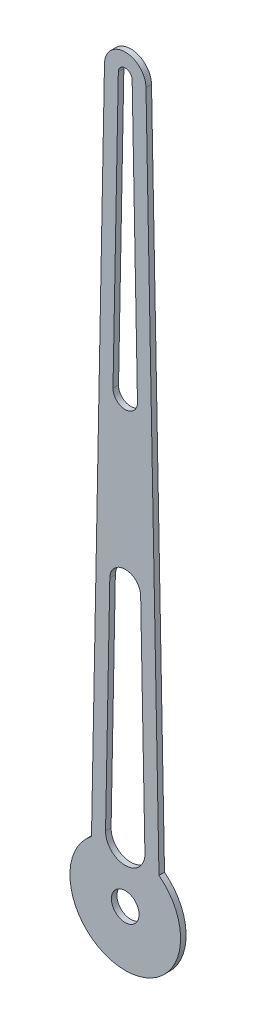
ISO-10303-21;
HEADER;
FILE_DESCRIPTION(('STEP AP214'),'2;1');
FILE_NAME('part.step','',(''),(''),'','','');
FILE_SCHEMA(('AUTOMOTIVE_DESIGN { 1 0 10303 214 1 1 1 1 }'));
ENDSEC;
DATA;
#1=APPLICATION_CONTEXT('core data for automotive mechanical design processes');
#2=APPLICATION_PROTOCOL_DEFINITION('international standard','automotive_design',2000,#1);
#3=PRODUCT_CONTEXT('',#1,'mechanical');
#4=PRODUCT('Part','Part','',(#3));
#5=PRODUCT_RELATED_PRODUCT_CATEGORY('part','',(#4));
#6=PRODUCT_DEFINITION_FORMATION('','',#4);
#7=PRODUCT_DEFINITION_CONTEXT('part definition',#1,'design');
#8=PRODUCT_DEFINITION('design','',#6,#7);
#9=PRODUCT_DEFINITION_SHAPE('','',#8);
#10=(LENGTH_UNIT() NAMED_UNIT(*) SI_UNIT(.MILLI.,.METRE.));
#11=(NAMED_UNIT(*) PLANE_ANGLE_UNIT() SI_UNIT($,.RADIAN.));
#12=(NAMED_UNIT(*) SI_UNIT($,.STERADIAN.) SOLID_ANGLE_UNIT());
#13=UNCERTAINTY_MEASURE_WITH_UNIT(LENGTH_MEASURE(1.E-05),#10,'distance_accuracy_value','');
#14=(GEOMETRIC_REPRESENTATION_CONTEXT(3) GLOBAL_UNCERTAINTY_ASSIGNED_CONTEXT((#13)) GLOBAL_UNIT_ASSIGNED_CONTEXT((#10,
#11,#12)) REPRESENTATION_CONTEXT('',''));
#15=CARTESIAN_POINT('',(0.,0.,0.));
#16=DIRECTION('',(0.,0.,1.));
#17=DIRECTION('',(1.,0.,0.));
#18=AXIS2_PLACEMENT_3D('',#15,#16,#17);
#19=CARTESIAN_POINT('',(0.,0.,0.1));
#20=DIRECTION('',(0.,0.,1.));
#21=DIRECTION('',(1.,0.,0.));
#22=AXIS2_PLACEMENT_3D('',#19,#20,#21);
#23=PLANE('',#22);
#24=CARTESIAN_POINT('',(0.,0.,0.1));
#25=DIRECTION('',(0.,0.,1.));
#26=DIRECTION('',(1.,0.,0.));
#27=AXIS2_PLACEMENT_3D('',#24,#25,#26);
#28=CIRCLE('',#27,0.25);
#29=CARTESIAN_POINT('',(0.25,0.,0.1));
#30=VERTEX_POINT('',#29);
#31=EDGE_CURVE('E161',#30,#30,#28,.T.);
#32=ORIENTED_EDGE('',*,*,#31,.F.);
#33=EDGE_LOOP('',(#32));
#34=FACE_BOUND('',#33,.T.);
#35=CARTESIAN_POINT('',(0.,0.,0.1));
#36=DIRECTION('',(0.,0.,1.));
#37=DIRECTION('',(1.,0.,0.));
#38=AXIS2_PLACEMENT_3D('',#35,#36,#37);
#39=CIRCLE('',#38,1.);
#40=CARTESIAN_POINT('',(-0.609872405367117,0.792499620928443,0.1));
#41=VERTEX_POINT('',#40);
#42=CARTESIAN_POINT('',(0.609872405367117,0.792499620928443,0.1));
#43=VERTEX_POINT('',#42);
#44=EDGE_CURVE('E198',#41,#43,#39,.T.);
#45=ORIENTED_EDGE('',*,*,#44,.T.);
#46=DIRECTION('',(-0.0192307692307692,0.999815071658151,0.));
#47=VECTOR('',#46,1.);
#48=CARTESIAN_POINT('',(0.374930651871806,13.0072115384615,0.1));
#49=LINE('',#48,#47);
#50=CARTESIAN_POINT('',(0.374930651871807,13.0072115384615,0.1));
#51=VERTEX_POINT('',#50);
#52=EDGE_CURVE('E201',#43,#51,#49,.T.);
#53=ORIENTED_EDGE('',*,*,#52,.T.);
#54=CARTESIAN_POINT('',(0.,13.,0.1));
#55=DIRECTION('',(0.,0.,1.));
#56=DIRECTION('',(1.,0.,0.));
#57=AXIS2_PLACEMENT_3D('',#54,#55,#56);
#58=CIRCLE('',#57,0.375);
#59=CARTESIAN_POINT('',(-0.374930651871806,13.0072115384615,0.1));
#60=VERTEX_POINT('',#59);
#61=EDGE_CURVE('E204',#51,#60,#58,.T.);
#62=ORIENTED_EDGE('',*,*,#61,.T.);
#63=DIRECTION('',(-0.0192307692307692,-0.999815071658151,0.));
#64=VECTOR('',#63,1.);
#65=CARTESIAN_POINT('',(-0.374930651871806,13.0072115384615,0.1));
#66=LINE('',#65,#64);
#67=EDGE_CURVE('E206',#60,#41,#66,.T.);
#68=ORIENTED_EDGE('',*,*,#67,.T.);
#69=EDGE_LOOP('',(#45,#53,#62,#68));
#70=FACE_BOUND('',#69,.T.);
#71=DIRECTION('',(-0.0192307692307692,-0.999815071658151,0.));
#72=VECTOR('',#71,1.);
#73=CARTESIAN_POINT('',(-0.124976883957269,13.0024038461538,0.1));
#74=LINE('',#73,#72);
#75=CARTESIAN_POINT('',(-0.124976883957269,13.0024038461538,0.1));
#76=VERTEX_POINT('',#75);
#77=CARTESIAN_POINT('',(-0.221112948539783,8.00425295857988,0.1));
#78=VERTEX_POINT('',#77);
#79=EDGE_CURVE('E169',#76,#78,#74,.T.);
#80=ORIENTED_EDGE('',*,*,#79,.F.);
#81=CARTESIAN_POINT('',(0.,13.,0.1));
#82=DIRECTION('',(0.,0.,1.));
#83=DIRECTION('',(1.,0.,0.));
#84=AXIS2_PLACEMENT_3D('',#81,#82,#83);
#85=CIRCLE('',#84,0.125);
#86=CARTESIAN_POINT('',(0.124976883957269,13.0024038461538,0.1));
#87=VERTEX_POINT('',#86);
#88=EDGE_CURVE('E167',#87,#76,#85,.T.);
#89=ORIENTED_EDGE('',*,*,#88,.F.);
#90=DIRECTION('',(-0.0192307692307692,0.999815071658151,0.));
#91=VECTOR('',#90,1.);
#92=CARTESIAN_POINT('',(0.124976883957269,13.0024038461538,0.1));
#93=LINE('',#92,#91);
#94=CARTESIAN_POINT('',(0.221112948539783,8.00425295857988,0.1));
#95=VERTEX_POINT('',#94);
#96=EDGE_CURVE('E175',#95,#87,#93,.T.);
#97=ORIENTED_EDGE('',*,*,#96,.F.);
#98=CARTESIAN_POINT('',(0.,8.,0.1));
#99=DIRECTION('',(0.,0.,1.));
#100=DIRECTION('',(1.,0.,0.));
#101=AXIS2_PLACEMENT_3D('',#98,#99,#100);
#102=CIRCLE('',#101,0.221153846153846);
#103=EDGE_CURVE('E172',#78,#95,#102,.T.);
#104=ORIENTED_EDGE('',*,*,#103,.F.);
#105=EDGE_LOOP('',(#80,#89,#97,#104));
#106=FACE_BOUND('',#105,.T.);
#107=DIRECTION('',(-0.0192307692307692,-0.999815071658151,0.));
#108=VECTOR('',#107,1.);
#109=CARTESIAN_POINT('',(-0.278794587289292,5.0053624260355,0.1));
#110=LINE('',#109,#108);
#111=CARTESIAN_POINT('',(-0.278794587289292,5.0053624260355,0.1));
#112=VERTEX_POINT('',#111);
#113=CARTESIAN_POINT('',(-0.355703438955304,1.00684171597633,0.1));
#114=VERTEX_POINT('',#113);
#115=EDGE_CURVE('E133',#112,#114,#110,.T.);
#116=ORIENTED_EDGE('',*,*,#115,.F.);
#117=CARTESIAN_POINT('',(0.,5.,0.1));
#118=DIRECTION('',(0.,0.,1.));
#119=DIRECTION('',(1.,0.,0.));
#120=AXIS2_PLACEMENT_3D('',#117,#118,#119);
#121=CIRCLE('',#120,0.278846153846154);
#122=CARTESIAN_POINT('',(0.278794587289292,5.0053624260355,0.1));
#123=VERTEX_POINT('',#122);
#124=EDGE_CURVE('E125',#123,#112,#121,.T.);
#125=ORIENTED_EDGE('',*,*,#124,.F.);
#126=DIRECTION('',(-0.0192307692307692,0.999815071658151,0.));
#127=VECTOR('',#126,1.);
#128=CARTESIAN_POINT('',(0.278794587289292,5.0053624260355,0.1));
#129=LINE('',#128,#127);
#130=CARTESIAN_POINT('',(0.355703438955304,1.00684171597633,0.1));
#131=VERTEX_POINT('',#130);
#132=EDGE_CURVE('E147',#131,#123,#129,.T.);
#133=ORIENTED_EDGE('',*,*,#132,.F.);
#134=CARTESIAN_POINT('',(0.,1.,0.1));
#135=DIRECTION('',(0.,0.,1.));
#136=DIRECTION('',(1.,0.,0.));
#137=AXIS2_PLACEMENT_3D('',#134,#135,#136);
#138=CIRCLE('',#137,0.355769230769231);
#139=EDGE_CURVE('E145',#114,#131,#138,.T.);
#140=ORIENTED_EDGE('',*,*,#139,.F.);
#141=EDGE_LOOP('',(#116,#125,#133,#140));
#142=FACE_BOUND('',#141,.T.);
#143=ADVANCED_FACE('F36',(#34,#70,#106,#142),#23,.T.);
#144=CARTESIAN_POINT('',(0.,0.,0.));
#145=DIRECTION('',(0.,0.,1.));
#146=DIRECTION('',(1.,0.,0.));
#147=AXIS2_PLACEMENT_3D('',#144,#145,#146);
#148=PLANE('',#147);
#149=CARTESIAN_POINT('',(0.,0.,0.));
#150=DIRECTION('',(0.,0.,1.));
#151=DIRECTION('',(1.,0.,0.));
#152=AXIS2_PLACEMENT_3D('',#149,#150,#151);
#153=CIRCLE('',#152,0.25);
#154=CARTESIAN_POINT('',(0.25,0.,0.));
#155=VERTEX_POINT('',#154);
#156=EDGE_CURVE('E141',#155,#155,#153,.T.);
#157=ORIENTED_EDGE('',*,*,#156,.T.);
#158=EDGE_LOOP('',(#157));
#159=FACE_BOUND('',#158,.T.);
#160=CARTESIAN_POINT('',(0.,0.,0.));
#161=DIRECTION('',(0.,0.,1.));
#162=DIRECTION('',(1.,0.,0.));
#163=AXIS2_PLACEMENT_3D('',#160,#161,#162);
#164=CIRCLE('',#163,1.);
#165=CARTESIAN_POINT('',(-0.609872405367117,0.792499620928443,0.));
#166=VERTEX_POINT('',#165);
#167=CARTESIAN_POINT('',(0.609872405367117,0.792499620928443,0.));
#168=VERTEX_POINT('',#167);
#169=EDGE_CURVE('E197',#166,#168,#164,.T.);
#170=ORIENTED_EDGE('',*,*,#169,.F.);
#171=DIRECTION('',(-0.0192307692307692,-0.999815071658151,0.));
#172=VECTOR('',#171,1.);
#173=CARTESIAN_POINT('',(-0.374930651871806,13.0072115384615,0.));
#174=LINE('',#173,#172);
#175=CARTESIAN_POINT('',(-0.374930651871806,13.0072115384615,0.));
#176=VERTEX_POINT('',#175);
#177=EDGE_CURVE('E202',#176,#166,#174,.T.);
#178=ORIENTED_EDGE('',*,*,#177,.F.);
#179=CARTESIAN_POINT('',(0.,13.,0.));
#180=DIRECTION('',(0.,0.,1.));
#181=DIRECTION('',(1.,0.,0.));
#182=AXIS2_PLACEMENT_3D('',#179,#180,#181);
#183=CIRCLE('',#182,0.375);
#184=CARTESIAN_POINT('',(0.374930651871807,13.0072115384615,0.));
#185=VERTEX_POINT('',#184);
#186=EDGE_CURVE('E213',#185,#176,#183,.T.);
#187=ORIENTED_EDGE('',*,*,#186,.F.);
#188=DIRECTION('',(-0.0192307692307692,0.999815071658151,0.));
#189=VECTOR('',#188,1.);
#190=CARTESIAN_POINT('',(0.374930651871806,13.0072115384615,0.));
#191=LINE('',#190,#189);
#192=EDGE_CURVE('E211',#168,#185,#191,.T.);
#193=ORIENTED_EDGE('',*,*,#192,.F.);
#194=EDGE_LOOP('',(#170,#178,#187,#193));
#195=FACE_BOUND('',#194,.T.);
#196=CARTESIAN_POINT('',(0.,13.,0.));
#197=DIRECTION('',(0.,0.,1.));
#198=DIRECTION('',(1.,0.,0.));
#199=AXIS2_PLACEMENT_3D('',#196,#197,#198);
#200=CIRCLE('',#199,0.125);
#201=CARTESIAN_POINT('',(0.124976883957269,13.0024038461538,0.));
#202=VERTEX_POINT('',#201);
#203=CARTESIAN_POINT('',(-0.124976883957269,13.0024038461538,0.));
#204=VERTEX_POINT('',#203);
#205=EDGE_CURVE('E164',#202,#204,#200,.T.);
#206=ORIENTED_EDGE('',*,*,#205,.T.);
#207=DIRECTION('',(-0.0192307692307692,-0.999815071658151,0.));
#208=VECTOR('',#207,1.);
#209=CARTESIAN_POINT('',(-0.124976883957269,13.0024038461538,0.));
#210=LINE('',#209,#208);
#211=CARTESIAN_POINT('',(-0.221112948539783,8.00425295857988,0.));
#212=VERTEX_POINT('',#211);
#213=EDGE_CURVE('E180',#204,#212,#210,.T.);
#214=ORIENTED_EDGE('',*,*,#213,.T.);
#215=CARTESIAN_POINT('',(0.,8.,0.));
#216=DIRECTION('',(0.,0.,1.));
#217=DIRECTION('',(1.,0.,0.));
#218=AXIS2_PLACEMENT_3D('',#215,#216,#217);
#219=CIRCLE('',#218,0.221153846153846);
#220=CARTESIAN_POINT('',(0.221112948539783,8.00425295857988,0.));
#221=VERTEX_POINT('',#220);
#222=EDGE_CURVE('E183',#212,#221,#219,.T.);
#223=ORIENTED_EDGE('',*,*,#222,.T.);
#224=DIRECTION('',(-0.0192307692307692,0.999815071658151,0.));
#225=VECTOR('',#224,1.);
#226=CARTESIAN_POINT('',(0.124976883957269,13.0024038461538,0.));
#227=LINE('',#226,#225);
#228=EDGE_CURVE('E170',#221,#202,#227,.T.);
#229=ORIENTED_EDGE('',*,*,#228,.T.);
#230=EDGE_LOOP('',(#206,#214,#223,#229));
#231=FACE_BOUND('',#230,.T.);
#232=CARTESIAN_POINT('',(0.,5.,0.));
#233=DIRECTION('',(0.,0.,1.));
#234=DIRECTION('',(1.,0.,0.));
#235=AXIS2_PLACEMENT_3D('',#232,#233,#234);
#236=CIRCLE('',#235,0.278846153846154);
#237=CARTESIAN_POINT('',(0.278794587289292,5.0053624260355,0.));
#238=VERTEX_POINT('',#237);
#239=CARTESIAN_POINT('',(-0.278794587289292,5.0053624260355,0.));
#240=VERTEX_POINT('',#239);
#241=EDGE_CURVE('E59',#238,#240,#236,.T.);
#242=ORIENTED_EDGE('',*,*,#241,.T.);
#243=DIRECTION('',(-0.0192307692307692,-0.999815071658151,0.));
#244=VECTOR('',#243,1.);
#245=CARTESIAN_POINT('',(-0.278794587289292,5.0053624260355,0.));
#246=LINE('',#245,#244);
#247=CARTESIAN_POINT('',(-0.355703438955304,1.00684171597633,0.));
#248=VERTEX_POINT('',#247);
#249=EDGE_CURVE('E140',#240,#248,#246,.T.);
#250=ORIENTED_EDGE('',*,*,#249,.T.);
#251=CARTESIAN_POINT('',(0.,1.,0.));
#252=DIRECTION('',(0.,0.,1.));
#253=DIRECTION('',(1.,0.,0.));
#254=AXIS2_PLACEMENT_3D('',#251,#252,#253);
#255=CIRCLE('',#254,0.355769230769231);
#256=CARTESIAN_POINT('',(0.355703438955304,1.00684171597633,0.));
#257=VERTEX_POINT('',#256);
#258=EDGE_CURVE('E153',#248,#257,#255,.T.);
#259=ORIENTED_EDGE('',*,*,#258,.T.);
#260=DIRECTION('',(-0.0192307692307692,0.999815071658151,0.));
#261=VECTOR('',#260,1.);
#262=CARTESIAN_POINT('',(0.278794587289292,5.0053624260355,0.));
#263=LINE('',#262,#261);
#264=EDGE_CURVE('E134',#257,#238,#263,.T.);
#265=ORIENTED_EDGE('',*,*,#264,.T.);
#266=EDGE_LOOP('',(#242,#250,#259,#265));
#267=FACE_BOUND('',#266,.T.);
#268=ADVANCED_FACE('F231',(#159,#195,#231,#267),#148,.F.);
#269=CARTESIAN_POINT('',(0.,0.,0.1));
#270=DIRECTION('',(0.,0.,-1.));
#271=DIRECTION('',(-1.,0.,0.));
#272=AXIS2_PLACEMENT_3D('',#269,#270,#271);
#273=CYLINDRICAL_SURFACE('',#272,1.);
#274=ORIENTED_EDGE('',*,*,#169,.T.);
#275=DIRECTION('',(0.,0.,-1.));
#276=VECTOR('',#275,1.);
#277=CARTESIAN_POINT('',(0.609872405367117,0.792499620928443,0.1));
#278=LINE('',#277,#276);
#279=EDGE_CURVE('E11',#43,#168,#278,.T.);
#280=ORIENTED_EDGE('',*,*,#279,.F.);
#281=ORIENTED_EDGE('',*,*,#44,.F.);
#282=DIRECTION('',(0.,0.,-1.));
#283=VECTOR('',#282,1.);
#284=CARTESIAN_POINT('',(-0.609872405367117,0.792499620928443,0.1));
#285=LINE('',#284,#283);
#286=EDGE_CURVE('E208',#41,#166,#285,.T.);
#287=ORIENTED_EDGE('',*,*,#286,.T.);
#288=EDGE_LOOP('',(#274,#280,#281,#287));
#289=FACE_BOUND('',#288,.T.);
#290=ADVANCED_FACE('F38',(#289),#273,.T.);
#291=CARTESIAN_POINT('',(0.374930651871806,13.0072115384615,0.1));
#292=DIRECTION('',(-0.999815071658151,-0.0192307692307692,0.));
#293=DIRECTION('',(0.0192307692307692,-0.999815071658151,0.));
#294=AXIS2_PLACEMENT_3D('',#291,#292,#293);
#295=PLANE('',#294);
#296=ORIENTED_EDGE('',*,*,#192,.T.);
#297=DIRECTION('',(0.,0.,-1.));
#298=VECTOR('',#297,1.);
#299=CARTESIAN_POINT('',(0.374930651871807,13.0072115384615,0.1));
#300=LINE('',#299,#298);
#301=EDGE_CURVE('E44',#51,#185,#300,.T.);
#302=ORIENTED_EDGE('',*,*,#301,.F.);
#303=ORIENTED_EDGE('',*,*,#52,.F.);
#304=ORIENTED_EDGE('',*,*,#279,.T.);
#305=EDGE_LOOP('',(#296,#302,#303,#304));
#306=FACE_BOUND('',#305,.T.);
#307=ADVANCED_FACE('F242',(#306),#295,.F.);
#308=CARTESIAN_POINT('',(0.,13.,0.1));
#309=DIRECTION('',(0.,0.,-1.));
#310=DIRECTION('',(-1.,0.,0.));
#311=AXIS2_PLACEMENT_3D('',#308,#309,#310);
#312=CYLINDRICAL_SURFACE('',#311,0.375);
#313=ORIENTED_EDGE('',*,*,#186,.T.);
#314=DIRECTION('',(0.,0.,-1.));
#315=VECTOR('',#314,1.);
#316=CARTESIAN_POINT('',(-0.374930651871806,13.0072115384615,0.1));
#317=LINE('',#316,#315);
#318=EDGE_CURVE('E218',#60,#176,#317,.T.);
#319=ORIENTED_EDGE('',*,*,#318,.F.);
#320=ORIENTED_EDGE('',*,*,#61,.F.);
#321=ORIENTED_EDGE('',*,*,#301,.T.);
#322=EDGE_LOOP('',(#313,#319,#320,#321));
#323=FACE_BOUND('',#322,.T.);
#324=ADVANCED_FACE('F225',(#323),#312,.T.);
#325=CARTESIAN_POINT('',(-0.374930651871806,13.0072115384615,0.1));
#326=DIRECTION('',(0.999815071658151,-0.0192307692307692,0.));
#327=DIRECTION('',(0.0192307692307692,0.999815071658151,0.));
#328=AXIS2_PLACEMENT_3D('',#325,#326,#327);
#329=PLANE('',#328);
#330=ORIENTED_EDGE('',*,*,#177,.T.);
#331=ORIENTED_EDGE('',*,*,#286,.F.);
#332=ORIENTED_EDGE('',*,*,#67,.F.);
#333=ORIENTED_EDGE('',*,*,#318,.T.);
#334=EDGE_LOOP('',(#330,#331,#332,#333));
#335=FACE_BOUND('',#334,.T.);
#336=ADVANCED_FACE('F235',(#335),#329,.F.);
#337=CARTESIAN_POINT('',(0.,13.,0.1));
#338=DIRECTION('',(0.,0.,-1.));
#339=DIRECTION('',(-1.,0.,0.));
#340=AXIS2_PLACEMENT_3D('',#337,#338,#339);
#341=CYLINDRICAL_SURFACE('',#340,0.125);
#342=ORIENTED_EDGE('',*,*,#205,.F.);
#343=DIRECTION('',(0.,0.,-1.));
#344=VECTOR('',#343,1.);
#345=CARTESIAN_POINT('',(0.124976883957269,13.0024038461538,0.1));
#346=LINE('',#345,#344);
#347=EDGE_CURVE('E177',#87,#202,#346,.T.);
#348=ORIENTED_EDGE('',*,*,#347,.F.);
#349=ORIENTED_EDGE('',*,*,#88,.T.);
#350=DIRECTION('',(0.,0.,-1.));
#351=VECTOR('',#350,1.);
#352=CARTESIAN_POINT('',(-0.124976883957269,13.0024038461538,0.1));
#353=LINE('',#352,#351);
#354=EDGE_CURVE('E194',#76,#204,#353,.T.);
#355=ORIENTED_EDGE('',*,*,#354,.T.);
#356=EDGE_LOOP('',(#342,#348,#349,#355));
#357=FACE_BOUND('',#356,.T.);
#358=ADVANCED_FACE('F259',(#357),#341,.F.);
#359=CARTESIAN_POINT('',(-0.124976883957269,13.0024038461538,0.1));
#360=DIRECTION('',(0.999815071658151,-0.0192307692307692,0.));
#361=DIRECTION('',(0.0192307692307692,0.999815071658151,0.));
#362=AXIS2_PLACEMENT_3D('',#359,#360,#361);
#363=PLANE('',#362);
#364=ORIENTED_EDGE('',*,*,#213,.F.);
#365=ORIENTED_EDGE('',*,*,#354,.F.);
#366=ORIENTED_EDGE('',*,*,#79,.T.);
#367=DIRECTION('',(0.,0.,-1.));
#368=VECTOR('',#367,1.);
#369=CARTESIAN_POINT('',(-0.221112948539783,8.00425295857988,0.1));
#370=LINE('',#369,#368);
#371=EDGE_CURVE('E192',#78,#212,#370,.T.);
#372=ORIENTED_EDGE('',*,*,#371,.T.);
#373=EDGE_LOOP('',(#364,#365,#366,#372));
#374=FACE_BOUND('',#373,.T.);
#375=ADVANCED_FACE('F266',(#374),#363,.T.);
#376=CARTESIAN_POINT('',(0.,8.,0.1));
#377=DIRECTION('',(0.,0.,-1.));
#378=DIRECTION('',(-1.,0.,0.));
#379=AXIS2_PLACEMENT_3D('',#376,#377,#378);
#380=CYLINDRICAL_SURFACE('',#379,0.221153846153846);
#381=ORIENTED_EDGE('',*,*,#222,.F.);
#382=ORIENTED_EDGE('',*,*,#371,.F.);
#383=ORIENTED_EDGE('',*,*,#103,.T.);
#384=DIRECTION('',(0.,0.,-1.));
#385=VECTOR('',#384,1.);
#386=CARTESIAN_POINT('',(0.221112948539783,8.00425295857988,0.1));
#387=LINE('',#386,#385);
#388=EDGE_CURVE('E190',#95,#221,#387,.T.);
#389=ORIENTED_EDGE('',*,*,#388,.T.);
#390=EDGE_LOOP('',(#381,#382,#383,#389));
#391=FACE_BOUND('',#390,.T.);
#392=ADVANCED_FACE('F271',(#391),#380,.F.);
#393=CARTESIAN_POINT('',(0.124976883957269,13.0024038461538,0.1));
#394=DIRECTION('',(-0.999815071658151,-0.0192307692307692,0.));
#395=DIRECTION('',(0.0192307692307692,-0.999815071658151,0.));
#396=AXIS2_PLACEMENT_3D('',#393,#394,#395);
#397=PLANE('',#396);
#398=ORIENTED_EDGE('',*,*,#228,.F.);
#399=ORIENTED_EDGE('',*,*,#388,.F.);
#400=ORIENTED_EDGE('',*,*,#96,.T.);
#401=ORIENTED_EDGE('',*,*,#347,.T.);
#402=EDGE_LOOP('',(#398,#399,#400,#401));
#403=FACE_BOUND('',#402,.T.);
#404=ADVANCED_FACE('F278',(#403),#397,.T.);
#405=CARTESIAN_POINT('',(0.,0.,0.1));
#406=DIRECTION('',(0.,0.,-1.));
#407=DIRECTION('',(-1.,0.,0.));
#408=AXIS2_PLACEMENT_3D('',#405,#406,#407);
#409=CYLINDRICAL_SURFACE('',#408,0.25);
#410=ORIENTED_EDGE('',*,*,#31,.T.);
#411=EDGE_LOOP('',(#410));
#412=FACE_BOUND('',#411,.T.);
#413=ORIENTED_EDGE('',*,*,#156,.F.);
#414=EDGE_LOOP('',(#413));
#415=FACE_BOUND('',#414,.T.);
#416=ADVANCED_FACE('F291',(#412,#415),#409,.F.);
#417=CARTESIAN_POINT('',(0.,5.,0.1));
#418=DIRECTION('',(0.,0.,-1.));
#419=DIRECTION('',(-1.,0.,0.));
#420=AXIS2_PLACEMENT_3D('',#417,#418,#419);
#421=CYLINDRICAL_SURFACE('',#420,0.278846153846154);
#422=ORIENTED_EDGE('',*,*,#241,.F.);
#423=DIRECTION('',(0.,0.,-1.));
#424=VECTOR('',#423,1.);
#425=CARTESIAN_POINT('',(0.278794587289292,5.0053624260355,0.1));
#426=LINE('',#425,#424);
#427=EDGE_CURVE('E129',#123,#238,#426,.T.);
#428=ORIENTED_EDGE('',*,*,#427,.F.);
#429=ORIENTED_EDGE('',*,*,#124,.T.);
#430=DIRECTION('',(0.,0.,-1.));
#431=VECTOR('',#430,1.);
#432=CARTESIAN_POINT('',(-0.278794587289292,5.0053624260355,0.1));
#433=LINE('',#432,#431);
#434=EDGE_CURVE('E128',#112,#240,#433,.T.);
#435=ORIENTED_EDGE('',*,*,#434,.T.);
#436=EDGE_LOOP('',(#422,#428,#429,#435));
#437=FACE_BOUND('',#436,.T.);
#438=ADVANCED_FACE('F127',(#437),#421,.F.);
#439=CARTESIAN_POINT('',(-0.278794587289292,5.0053624260355,0.1));
#440=DIRECTION('',(0.999815071658151,-0.0192307692307692,0.));
#441=DIRECTION('',(0.0192307692307692,0.999815071658151,0.));
#442=AXIS2_PLACEMENT_3D('',#439,#440,#441);
#443=PLANE('',#442);
#444=ORIENTED_EDGE('',*,*,#249,.F.);
#445=ORIENTED_EDGE('',*,*,#434,.F.);
#446=ORIENTED_EDGE('',*,*,#115,.T.);
#447=DIRECTION('',(0.,0.,-1.));
#448=VECTOR('',#447,1.);
#449=CARTESIAN_POINT('',(-0.355703438955304,1.00684171597633,0.1));
#450=LINE('',#449,#448);
#451=EDGE_CURVE('E142',#114,#248,#450,.T.);
#452=ORIENTED_EDGE('',*,*,#451,.T.);
#453=EDGE_LOOP('',(#444,#445,#446,#452));
#454=FACE_BOUND('',#453,.T.);
#455=ADVANCED_FACE('F137',(#454),#443,.T.);
#456=CARTESIAN_POINT('',(0.,1.,0.1));
#457=DIRECTION('',(0.,0.,-1.));
#458=DIRECTION('',(-1.,0.,0.));
#459=AXIS2_PLACEMENT_3D('',#456,#457,#458);
#460=CYLINDRICAL_SURFACE('',#459,0.355769230769231);
#461=ORIENTED_EDGE('',*,*,#258,.F.);
#462=ORIENTED_EDGE('',*,*,#451,.F.);
#463=ORIENTED_EDGE('',*,*,#139,.T.);
#464=DIRECTION('',(0.,0.,-1.));
#465=VECTOR('',#464,1.);
#466=CARTESIAN_POINT('',(0.355703438955304,1.00684171597633,0.1));
#467=LINE('',#466,#465);
#468=EDGE_CURVE('E51',#131,#257,#467,.T.);
#469=ORIENTED_EDGE('',*,*,#468,.T.);
#470=EDGE_LOOP('',(#461,#462,#463,#469));
#471=FACE_BOUND('',#470,.T.);
#472=ADVANCED_FACE('F301',(#471),#460,.F.);
#473=CARTESIAN_POINT('',(0.278794587289292,5.0053624260355,0.1));
#474=DIRECTION('',(-0.999815071658151,-0.0192307692307692,0.));
#475=DIRECTION('',(0.0192307692307692,-0.999815071658151,0.));
#476=AXIS2_PLACEMENT_3D('',#473,#474,#475);
#477=PLANE('',#476);
#478=ORIENTED_EDGE('',*,*,#264,.F.);
#479=ORIENTED_EDGE('',*,*,#468,.F.);
#480=ORIENTED_EDGE('',*,*,#132,.T.);
#481=ORIENTED_EDGE('',*,*,#427,.T.);
#482=EDGE_LOOP('',(#478,#479,#480,#481));
#483=FACE_BOUND('',#482,.T.);
#484=ADVANCED_FACE('F304',(#483),#477,.T.);
#485=CLOSED_SHELL('',(#143,#268,#290,#307,#324,#336,#358,#375,#392,#404,#416,#438,#455,#472,#484));
#486=MANIFOLD_SOLID_BREP('B2',#485);
#487=ADVANCED_BREP_SHAPE_REPRESENTATION('',(#18,#486),#14);
#488=SHAPE_DEFINITION_REPRESENTATION(#9,#487);
ENDSEC;
END-ISO-10303-21;
